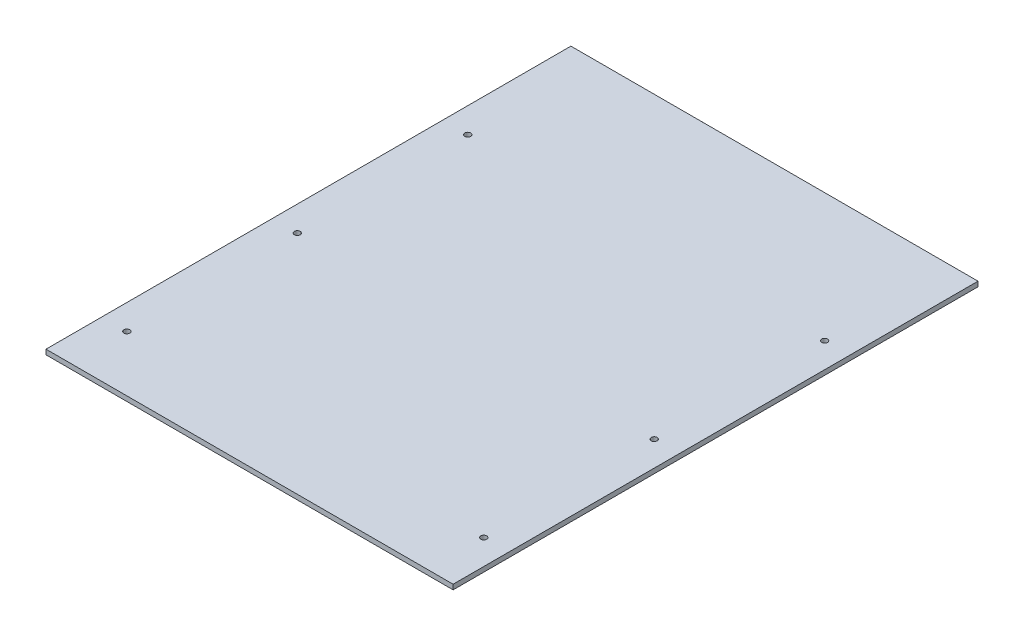
ISO-10303-21;
HEADER;
FILE_DESCRIPTION(('STEP AP214'),'2;1');
FILE_NAME('part.step','',(''),(''),'','','');
FILE_SCHEMA(('AUTOMOTIVE_DESIGN { 1 0 10303 214 1 1 1 1 }'));
ENDSEC;
DATA;
#1=APPLICATION_CONTEXT('core data for automotive mechanical design processes');
#2=APPLICATION_PROTOCOL_DEFINITION('international standard','automotive_design',2000,#1);
#3=PRODUCT_CONTEXT('',#1,'mechanical');
#4=PRODUCT('Part','Part','',(#3));
#5=PRODUCT_RELATED_PRODUCT_CATEGORY('part','',(#4));
#6=PRODUCT_DEFINITION_FORMATION('','',#4);
#7=PRODUCT_DEFINITION_CONTEXT('part definition',#1,'design');
#8=PRODUCT_DEFINITION('design','',#6,#7);
#9=PRODUCT_DEFINITION_SHAPE('','',#8);
#10=(LENGTH_UNIT() NAMED_UNIT(*) SI_UNIT(.MILLI.,.METRE.));
#11=(NAMED_UNIT(*) PLANE_ANGLE_UNIT() SI_UNIT($,.RADIAN.));
#12=(NAMED_UNIT(*) SI_UNIT($,.STERADIAN.) SOLID_ANGLE_UNIT());
#13=UNCERTAINTY_MEASURE_WITH_UNIT(LENGTH_MEASURE(1.E-05),#10,'distance_accuracy_value','');
#14=(GEOMETRIC_REPRESENTATION_CONTEXT(3) GLOBAL_UNCERTAINTY_ASSIGNED_CONTEXT((#13)) GLOBAL_UNIT_ASSIGNED_CONTEXT((#10,
#11,#12)) REPRESENTATION_CONTEXT('',''));
#15=CARTESIAN_POINT('',(0.,0.,0.));
#16=DIRECTION('',(0.,0.,1.));
#17=DIRECTION('',(1.,0.,0.));
#18=AXIS2_PLACEMENT_3D('',#15,#16,#17);
#19=CARTESIAN_POINT('',(0.,5.588,0.));
#20=DIRECTION('',(0.,-1.,0.));
#21=DIRECTION('',(0.,0.,-1.));
#22=AXIS2_PLACEMENT_3D('',#19,#20,#21);
#23=PLANE('',#22);
#24=DIRECTION('',(0.,0.,1.));
#25=VECTOR('',#24,1.);
#26=CARTESIAN_POINT('',(0.,5.588,0.));
#27=LINE('',#26,#25);
#28=CARTESIAN_POINT('',(0.,5.588,-597.662));
#29=VERTEX_POINT('',#28);
#30=CARTESIAN_POINT('',(0.,5.588,0.));
#31=VERTEX_POINT('',#30);
#32=EDGE_CURVE('E85',#29,#31,#27,.T.);
#33=ORIENTED_EDGE('',*,*,#32,.T.);
#34=DIRECTION('',(1.,0.,0.));
#35=VECTOR('',#34,1.);
#36=CARTESIAN_POINT('',(0.,5.588,0.));
#37=LINE('',#36,#35);
#38=CARTESIAN_POINT('',(463.55,5.588,0.));
#39=VERTEX_POINT('',#38);
#40=EDGE_CURVE('E80',#31,#39,#37,.T.);
#41=ORIENTED_EDGE('',*,*,#40,.T.);
#42=DIRECTION('',(0.,0.,-1.));
#43=VECTOR('',#42,1.);
#44=CARTESIAN_POINT('',(463.55,5.588,0.));
#45=LINE('',#44,#43);
#46=CARTESIAN_POINT('',(463.55,5.588,-597.662));
#47=VERTEX_POINT('',#46);
#48=EDGE_CURVE('E83',#39,#47,#45,.T.);
#49=ORIENTED_EDGE('',*,*,#48,.T.);
#50=DIRECTION('',(-1.,0.,0.));
#51=VECTOR('',#50,1.);
#52=CARTESIAN_POINT('',(0.,5.588,-597.662));
#53=LINE('',#52,#51);
#54=EDGE_CURVE('E50',#47,#29,#53,.T.);
#55=ORIENTED_EDGE('',*,*,#54,.T.);
#56=EDGE_LOOP('',(#33,#41,#49,#55));
#57=FACE_BOUND('',#56,.T.);
#58=CARTESIAN_POINT('',(28.575,5.588,-63.5));
#59=DIRECTION('',(0.,1.,0.));
#60=DIRECTION('',(0.,0.,1.));
#61=AXIS2_PLACEMENT_3D('',#58,#59,#60);
#62=CIRCLE('',#61,3.37820000000001);
#63=CARTESIAN_POINT('',(28.575,5.588,-60.1218));
#64=VERTEX_POINT('',#63);
#65=EDGE_CURVE('E100',#64,#64,#62,.T.);
#66=ORIENTED_EDGE('',*,*,#65,.F.);
#67=EDGE_LOOP('',(#66));
#68=FACE_BOUND('',#67,.T.);
#69=CARTESIAN_POINT('',(28.575,5.588,-257.556));
#70=DIRECTION('',(0.,1.,0.));
#71=DIRECTION('',(0.,0.,1.));
#72=AXIS2_PLACEMENT_3D('',#69,#70,#71);
#73=CIRCLE('',#72,3.37819999999999);
#74=CARTESIAN_POINT('',(28.575,5.588,-254.1778));
#75=VERTEX_POINT('',#74);
#76=EDGE_CURVE('E115',#75,#75,#73,.T.);
#77=ORIENTED_EDGE('',*,*,#76,.F.);
#78=EDGE_LOOP('',(#77));
#79=FACE_BOUND('',#78,.T.);
#80=CARTESIAN_POINT('',(28.575,5.588,-451.612));
#81=DIRECTION('',(0.,1.,0.));
#82=DIRECTION('',(0.,0.,1.));
#83=AXIS2_PLACEMENT_3D('',#80,#81,#82);
#84=CIRCLE('',#83,3.37819999999999);
#85=CARTESIAN_POINT('',(28.575,5.588,-448.2338));
#86=VERTEX_POINT('',#85);
#87=EDGE_CURVE('E121',#86,#86,#84,.T.);
#88=ORIENTED_EDGE('',*,*,#87,.F.);
#89=EDGE_LOOP('',(#88));
#90=FACE_BOUND('',#89,.T.);
#91=CARTESIAN_POINT('',(434.975,5.588,-451.612));
#92=DIRECTION('',(0.,1.,0.));
#93=DIRECTION('',(0.,0.,-1.));
#94=AXIS2_PLACEMENT_3D('',#91,#92,#93);
#95=CIRCLE('',#94,3.37819999999999);
#96=CARTESIAN_POINT('',(434.975,5.588,-454.9902));
#97=VERTEX_POINT('',#96);
#98=EDGE_CURVE('E127',#97,#97,#95,.T.);
#99=ORIENTED_EDGE('',*,*,#98,.F.);
#100=EDGE_LOOP('',(#99));
#101=FACE_BOUND('',#100,.T.);
#102=CARTESIAN_POINT('',(434.975,5.588,-257.556));
#103=DIRECTION('',(0.,1.,0.));
#104=DIRECTION('',(0.,0.,-1.));
#105=AXIS2_PLACEMENT_3D('',#102,#103,#104);
#106=CIRCLE('',#105,3.37819999999999);
#107=CARTESIAN_POINT('',(434.975,5.588,-260.9342));
#108=VERTEX_POINT('',#107);
#109=EDGE_CURVE('E133',#108,#108,#106,.T.);
#110=ORIENTED_EDGE('',*,*,#109,.F.);
#111=EDGE_LOOP('',(#110));
#112=FACE_BOUND('',#111,.T.);
#113=CARTESIAN_POINT('',(434.975,5.588,-63.5000000000001));
#114=DIRECTION('',(0.,1.,0.));
#115=DIRECTION('',(0.,0.,-1.));
#116=AXIS2_PLACEMENT_3D('',#113,#114,#115);
#117=CIRCLE('',#116,3.37819999999999);
#118=CARTESIAN_POINT('',(434.975,5.588,-66.8782));
#119=VERTEX_POINT('',#118);
#120=EDGE_CURVE('E139',#119,#119,#117,.T.);
#121=ORIENTED_EDGE('',*,*,#120,.F.);
#122=EDGE_LOOP('',(#121));
#123=FACE_BOUND('',#122,.T.);
#124=ADVANCED_FACE('F33',(#57,#68,#79,#90,#101,#112,#123),#23,.F.);
#125=CARTESIAN_POINT('',(0.,0.,0.));
#126=DIRECTION('',(0.,-1.,0.));
#127=DIRECTION('',(0.,0.,-1.));
#128=AXIS2_PLACEMENT_3D('',#125,#126,#127);
#129=PLANE('',#128);
#130=CARTESIAN_POINT('',(434.975,0.,-257.556));
#131=DIRECTION('',(0.,1.,0.));
#132=DIRECTION('',(0.,0.,-1.));
#133=AXIS2_PLACEMENT_3D('',#130,#131,#132);
#134=CIRCLE('',#133,3.37819999999999);
#135=CARTESIAN_POINT('',(434.975,0.,-260.9342));
#136=VERTEX_POINT('',#135);
#137=EDGE_CURVE('E136',#136,#136,#134,.T.);
#138=ORIENTED_EDGE('',*,*,#137,.T.);
#139=EDGE_LOOP('',(#138));
#140=FACE_BOUND('',#139,.T.);
#141=CARTESIAN_POINT('',(28.575,0.,-451.612));
#142=DIRECTION('',(0.,1.,0.));
#143=DIRECTION('',(0.,0.,1.));
#144=AXIS2_PLACEMENT_3D('',#141,#142,#143);
#145=CIRCLE('',#144,3.37819999999999);
#146=CARTESIAN_POINT('',(28.575,0.,-448.2338));
#147=VERTEX_POINT('',#146);
#148=EDGE_CURVE('E124',#147,#147,#145,.T.);
#149=ORIENTED_EDGE('',*,*,#148,.T.);
#150=EDGE_LOOP('',(#149));
#151=FACE_BOUND('',#150,.T.);
#152=CARTESIAN_POINT('',(28.575,0.,-63.5));
#153=DIRECTION('',(0.,1.,0.));
#154=DIRECTION('',(0.,0.,1.));
#155=AXIS2_PLACEMENT_3D('',#152,#153,#154);
#156=CIRCLE('',#155,3.37820000000001);
#157=CARTESIAN_POINT('',(28.575,0.,-60.1218));
#158=VERTEX_POINT('',#157);
#159=EDGE_CURVE('E112',#158,#158,#156,.T.);
#160=ORIENTED_EDGE('',*,*,#159,.T.);
#161=EDGE_LOOP('',(#160));
#162=FACE_BOUND('',#161,.T.);
#163=DIRECTION('',(0.,0.,1.));
#164=VECTOR('',#163,1.);
#165=CARTESIAN_POINT('',(0.,0.,0.));
#166=LINE('',#165,#164);
#167=CARTESIAN_POINT('',(0.,0.,-597.662));
#168=VERTEX_POINT('',#167);
#169=CARTESIAN_POINT('',(0.,0.,0.));
#170=VERTEX_POINT('',#169);
#171=EDGE_CURVE('E97',#168,#170,#166,.T.);
#172=ORIENTED_EDGE('',*,*,#171,.F.);
#173=DIRECTION('',(-1.,0.,0.));
#174=VECTOR('',#173,1.);
#175=CARTESIAN_POINT('',(0.,0.,-597.662));
#176=LINE('',#175,#174);
#177=CARTESIAN_POINT('',(463.55,0.,-597.662));
#178=VERTEX_POINT('',#177);
#179=EDGE_CURVE('E73',#178,#168,#176,.T.);
#180=ORIENTED_EDGE('',*,*,#179,.F.);
#181=DIRECTION('',(0.,0.,-1.));
#182=VECTOR('',#181,1.);
#183=CARTESIAN_POINT('',(463.55,0.,0.));
#184=LINE('',#183,#182);
#185=CARTESIAN_POINT('',(463.55,0.,0.));
#186=VERTEX_POINT('',#185);
#187=EDGE_CURVE('E67',#186,#178,#184,.T.);
#188=ORIENTED_EDGE('',*,*,#187,.F.);
#189=DIRECTION('',(1.,0.,0.));
#190=VECTOR('',#189,1.);
#191=CARTESIAN_POINT('',(0.,0.,0.));
#192=LINE('',#191,#190);
#193=EDGE_CURVE('E89',#170,#186,#192,.T.);
#194=ORIENTED_EDGE('',*,*,#193,.F.);
#195=EDGE_LOOP('',(#172,#180,#188,#194));
#196=FACE_BOUND('',#195,.T.);
#197=CARTESIAN_POINT('',(28.575,0.,-257.556));
#198=DIRECTION('',(0.,1.,0.));
#199=DIRECTION('',(0.,0.,1.));
#200=AXIS2_PLACEMENT_3D('',#197,#198,#199);
#201=CIRCLE('',#200,3.37819999999999);
#202=CARTESIAN_POINT('',(28.575,0.,-254.1778));
#203=VERTEX_POINT('',#202);
#204=EDGE_CURVE('E118',#203,#203,#201,.T.);
#205=ORIENTED_EDGE('',*,*,#204,.T.);
#206=EDGE_LOOP('',(#205));
#207=FACE_BOUND('',#206,.T.);
#208=CARTESIAN_POINT('',(434.975,0.,-451.612));
#209=DIRECTION('',(0.,1.,0.));
#210=DIRECTION('',(0.,0.,-1.));
#211=AXIS2_PLACEMENT_3D('',#208,#209,#210);
#212=CIRCLE('',#211,3.37819999999999);
#213=CARTESIAN_POINT('',(434.975,0.,-454.9902));
#214=VERTEX_POINT('',#213);
#215=EDGE_CURVE('E130',#214,#214,#212,.T.);
#216=ORIENTED_EDGE('',*,*,#215,.T.);
#217=EDGE_LOOP('',(#216));
#218=FACE_BOUND('',#217,.T.);
#219=CARTESIAN_POINT('',(434.975,0.,-63.5000000000001));
#220=DIRECTION('',(0.,1.,0.));
#221=DIRECTION('',(0.,0.,-1.));
#222=AXIS2_PLACEMENT_3D('',#219,#220,#221);
#223=CIRCLE('',#222,3.37819999999999);
#224=CARTESIAN_POINT('',(434.975,0.,-66.8782));
#225=VERTEX_POINT('',#224);
#226=EDGE_CURVE('E142',#225,#225,#223,.T.);
#227=ORIENTED_EDGE('',*,*,#226,.T.);
#228=EDGE_LOOP('',(#227));
#229=FACE_BOUND('',#228,.T.);
#230=ADVANCED_FACE('F108',(#140,#151,#162,#196,#207,#218,#229),#129,.T.);
#231=CARTESIAN_POINT('',(0.,5.588,0.));
#232=DIRECTION('',(1.,0.,0.));
#233=DIRECTION('',(0.,0.,-1.));
#234=AXIS2_PLACEMENT_3D('',#231,#232,#233);
#235=PLANE('',#234);
#236=ORIENTED_EDGE('',*,*,#171,.T.);
#237=DIRECTION('',(0.,-1.,0.));
#238=VECTOR('',#237,1.);
#239=CARTESIAN_POINT('',(0.,5.588,0.));
#240=LINE('',#239,#238);
#241=EDGE_CURVE('E11',#31,#170,#240,.T.);
#242=ORIENTED_EDGE('',*,*,#241,.F.);
#243=ORIENTED_EDGE('',*,*,#32,.F.);
#244=DIRECTION('',(0.,-1.,0.));
#245=VECTOR('',#244,1.);
#246=CARTESIAN_POINT('',(0.,5.588,-597.662));
#247=LINE('',#246,#245);
#248=EDGE_CURVE('E93',#29,#168,#247,.T.);
#249=ORIENTED_EDGE('',*,*,#248,.T.);
#250=EDGE_LOOP('',(#236,#242,#243,#249));
#251=FACE_BOUND('',#250,.T.);
#252=ADVANCED_FACE('F35',(#251),#235,.F.);
#253=CARTESIAN_POINT('',(0.,5.588,0.));
#254=DIRECTION('',(0.,0.,-1.));
#255=DIRECTION('',(-1.,0.,0.));
#256=AXIS2_PLACEMENT_3D('',#253,#254,#255);
#257=PLANE('',#256);
#258=ORIENTED_EDGE('',*,*,#193,.T.);
#259=DIRECTION('',(0.,-1.,0.));
#260=VECTOR('',#259,1.);
#261=CARTESIAN_POINT('',(463.55,5.588,0.));
#262=LINE('',#261,#260);
#263=EDGE_CURVE('E42',#39,#186,#262,.T.);
#264=ORIENTED_EDGE('',*,*,#263,.F.);
#265=ORIENTED_EDGE('',*,*,#40,.F.);
#266=ORIENTED_EDGE('',*,*,#241,.T.);
#267=EDGE_LOOP('',(#258,#264,#265,#266));
#268=FACE_BOUND('',#267,.T.);
#269=ADVANCED_FACE('F88',(#268),#257,.F.);
#270=CARTESIAN_POINT('',(463.55,5.588,0.));
#271=DIRECTION('',(-1.,0.,0.));
#272=DIRECTION('',(0.,0.,1.));
#273=AXIS2_PLACEMENT_3D('',#270,#271,#272);
#274=PLANE('',#273);
#275=ORIENTED_EDGE('',*,*,#187,.T.);
#276=DIRECTION('',(0.,-1.,0.));
#277=VECTOR('',#276,1.);
#278=CARTESIAN_POINT('',(463.55,5.588,-597.662));
#279=LINE('',#278,#277);
#280=EDGE_CURVE('E90',#47,#178,#279,.T.);
#281=ORIENTED_EDGE('',*,*,#280,.F.);
#282=ORIENTED_EDGE('',*,*,#48,.F.);
#283=ORIENTED_EDGE('',*,*,#263,.T.);
#284=EDGE_LOOP('',(#275,#281,#282,#283));
#285=FACE_BOUND('',#284,.T.);
#286=ADVANCED_FACE('F91',(#285),#274,.F.);
#287=CARTESIAN_POINT('',(0.,5.588,-597.662));
#288=DIRECTION('',(0.,0.,1.));
#289=DIRECTION('',(1.,0.,0.));
#290=AXIS2_PLACEMENT_3D('',#287,#288,#289);
#291=PLANE('',#290);
#292=ORIENTED_EDGE('',*,*,#179,.T.);
#293=ORIENTED_EDGE('',*,*,#248,.F.);
#294=ORIENTED_EDGE('',*,*,#54,.F.);
#295=ORIENTED_EDGE('',*,*,#280,.T.);
#296=EDGE_LOOP('',(#292,#293,#294,#295));
#297=FACE_BOUND('',#296,.T.);
#298=ADVANCED_FACE('F105',(#297),#291,.F.);
#299=CARTESIAN_POINT('',(28.575,5.588,-63.5));
#300=DIRECTION('',(0.,-1.,0.));
#301=DIRECTION('',(0.,0.,-1.));
#302=AXIS2_PLACEMENT_3D('',#299,#300,#301);
#303=CYLINDRICAL_SURFACE('',#302,3.37820000000001);
#304=ORIENTED_EDGE('',*,*,#65,.T.);
#305=EDGE_LOOP('',(#304));
#306=FACE_BOUND('',#305,.T.);
#307=ORIENTED_EDGE('',*,*,#159,.F.);
#308=EDGE_LOOP('',(#307));
#309=FACE_BOUND('',#308,.T.);
#310=ADVANCED_FACE('F159',(#306,#309),#303,.F.);
#311=CARTESIAN_POINT('',(28.575,5.588,-257.556));
#312=DIRECTION('',(0.,-1.,0.));
#313=DIRECTION('',(0.,0.,-1.));
#314=AXIS2_PLACEMENT_3D('',#311,#312,#313);
#315=CYLINDRICAL_SURFACE('',#314,3.37819999999999);
#316=ORIENTED_EDGE('',*,*,#76,.T.);
#317=EDGE_LOOP('',(#316));
#318=FACE_BOUND('',#317,.T.);
#319=ORIENTED_EDGE('',*,*,#204,.F.);
#320=EDGE_LOOP('',(#319));
#321=FACE_BOUND('',#320,.T.);
#322=ADVANCED_FACE('F205',(#318,#321),#315,.F.);
#323=CARTESIAN_POINT('',(28.575,5.588,-451.612));
#324=DIRECTION('',(0.,-1.,0.));
#325=DIRECTION('',(0.,0.,-1.));
#326=AXIS2_PLACEMENT_3D('',#323,#324,#325);
#327=CYLINDRICAL_SURFACE('',#326,3.37819999999999);
#328=ORIENTED_EDGE('',*,*,#87,.T.);
#329=EDGE_LOOP('',(#328));
#330=FACE_BOUND('',#329,.T.);
#331=ORIENTED_EDGE('',*,*,#148,.F.);
#332=EDGE_LOOP('',(#331));
#333=FACE_BOUND('',#332,.T.);
#334=ADVANCED_FACE('F213',(#330,#333),#327,.F.);
#335=CARTESIAN_POINT('',(434.975,5.588,-451.612));
#336=DIRECTION('',(0.,-1.,0.));
#337=DIRECTION('',(0.,0.,-1.));
#338=AXIS2_PLACEMENT_3D('',#335,#336,#337);
#339=CYLINDRICAL_SURFACE('',#338,3.37819999999999);
#340=ORIENTED_EDGE('',*,*,#98,.T.);
#341=EDGE_LOOP('',(#340));
#342=FACE_BOUND('',#341,.T.);
#343=ORIENTED_EDGE('',*,*,#215,.F.);
#344=EDGE_LOOP('',(#343));
#345=FACE_BOUND('',#344,.T.);
#346=ADVANCED_FACE('F221',(#342,#345),#339,.F.);
#347=CARTESIAN_POINT('',(434.975,5.588,-257.556));
#348=DIRECTION('',(0.,-1.,0.));
#349=DIRECTION('',(0.,0.,-1.));
#350=AXIS2_PLACEMENT_3D('',#347,#348,#349);
#351=CYLINDRICAL_SURFACE('',#350,3.37819999999999);
#352=ORIENTED_EDGE('',*,*,#109,.T.);
#353=EDGE_LOOP('',(#352));
#354=FACE_BOUND('',#353,.T.);
#355=ORIENTED_EDGE('',*,*,#137,.F.);
#356=EDGE_LOOP('',(#355));
#357=FACE_BOUND('',#356,.T.);
#358=ADVANCED_FACE('F230',(#354,#357),#351,.F.);
#359=CARTESIAN_POINT('',(434.975,5.588,-63.5000000000001));
#360=DIRECTION('',(0.,-1.,0.));
#361=DIRECTION('',(0.,0.,-1.));
#362=AXIS2_PLACEMENT_3D('',#359,#360,#361);
#363=CYLINDRICAL_SURFACE('',#362,3.37819999999999);
#364=ORIENTED_EDGE('',*,*,#120,.T.);
#365=EDGE_LOOP('',(#364));
#366=FACE_BOUND('',#365,.T.);
#367=ORIENTED_EDGE('',*,*,#226,.F.);
#368=EDGE_LOOP('',(#367));
#369=FACE_BOUND('',#368,.T.);
#370=ADVANCED_FACE('F148',(#366,#369),#363,.F.);
#371=CLOSED_SHELL('',(#124,#230,#252,#269,#286,#298,#310,#322,#334,#346,#358,#370));
#372=MANIFOLD_SOLID_BREP('B2',#371);
#373=ADVANCED_BREP_SHAPE_REPRESENTATION('',(#18,#372),#14);
#374=SHAPE_DEFINITION_REPRESENTATION(#9,#373);
ENDSEC;
END-ISO-10303-21;
